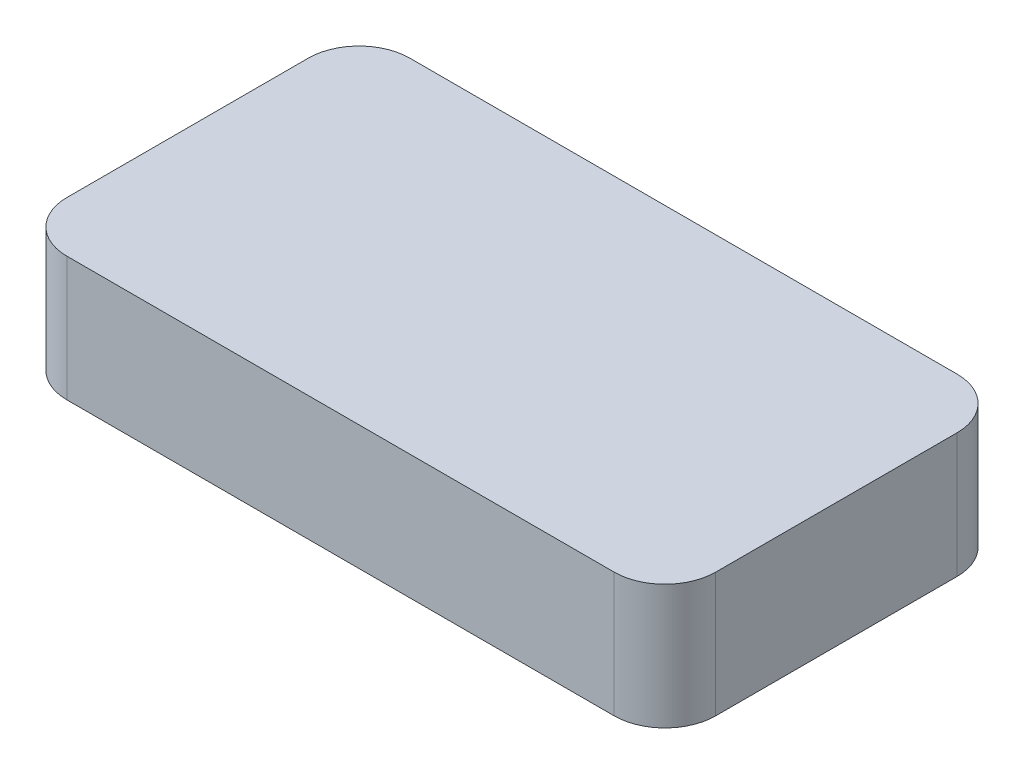
ISO-10303-21;
HEADER;
FILE_DESCRIPTION(('STEP AP214'),'2;1');
FILE_NAME('part.step','',(''),(''),'','','');
FILE_SCHEMA(('AUTOMOTIVE_DESIGN { 1 0 10303 214 1 1 1 1 }'));
ENDSEC;
DATA;
#1=APPLICATION_CONTEXT('core data for automotive mechanical design processes');
#2=APPLICATION_PROTOCOL_DEFINITION('international standard','automotive_design',2000,#1);
#3=PRODUCT_CONTEXT('',#1,'mechanical');
#4=PRODUCT('Part','Part','',(#3));
#5=PRODUCT_RELATED_PRODUCT_CATEGORY('part','',(#4));
#6=PRODUCT_DEFINITION_FORMATION('','',#4);
#7=PRODUCT_DEFINITION_CONTEXT('part definition',#1,'design');
#8=PRODUCT_DEFINITION('design','',#6,#7);
#9=PRODUCT_DEFINITION_SHAPE('','',#8);
#10=(LENGTH_UNIT() NAMED_UNIT(*) SI_UNIT(.MILLI.,.METRE.));
#11=(NAMED_UNIT(*) PLANE_ANGLE_UNIT() SI_UNIT($,.RADIAN.));
#12=(NAMED_UNIT(*) SI_UNIT($,.STERADIAN.) SOLID_ANGLE_UNIT());
#13=UNCERTAINTY_MEASURE_WITH_UNIT(LENGTH_MEASURE(1.E-05),#10,'distance_accuracy_value','');
#14=(GEOMETRIC_REPRESENTATION_CONTEXT(3) GLOBAL_UNCERTAINTY_ASSIGNED_CONTEXT((#13)) GLOBAL_UNIT_ASSIGNED_CONTEXT((#10,
#11,#12)) REPRESENTATION_CONTEXT('',''));
#15=CARTESIAN_POINT('',(0.,0.,0.));
#16=DIRECTION('',(0.,0.,1.));
#17=DIRECTION('',(1.,0.,0.));
#18=AXIS2_PLACEMENT_3D('',#15,#16,#17);
#19=CARTESIAN_POINT('',(0.,6.223,0.));
#20=DIRECTION('',(1.,0.,0.));
#21=DIRECTION('',(0.,0.,-1.));
#22=AXIS2_PLACEMENT_3D('',#19,#20,#21);
#23=PLANE('',#22);
#24=DIRECTION('',(0.,0.,1.));
#25=VECTOR('',#24,1.);
#26=CARTESIAN_POINT('',(0.,0.,0.));
#27=LINE('',#26,#25);
#28=CARTESIAN_POINT('',(0.,0.,-14.605));
#29=VERTEX_POINT('',#28);
#30=CARTESIAN_POINT('',(0.,0.,-2.54));
#31=VERTEX_POINT('',#30);
#32=EDGE_CURVE('E157',#29,#31,#27,.T.);
#33=ORIENTED_EDGE('',*,*,#32,.T.);
#34=DIRECTION('',(0.,-1.,0.));
#35=VECTOR('',#34,1.);
#36=CARTESIAN_POINT('',(0.,6.223,-2.54));
#37=LINE('',#36,#35);
#38=CARTESIAN_POINT('',(0.,6.223,-2.54));
#39=VERTEX_POINT('',#38);
#40=EDGE_CURVE('E11',#31,#39,#37,.F.);
#41=ORIENTED_EDGE('',*,*,#40,.T.);
#42=DIRECTION('',(0.,0.,1.));
#43=VECTOR('',#42,1.);
#44=CARTESIAN_POINT('',(0.,6.223,0.));
#45=LINE('',#44,#43);
#46=CARTESIAN_POINT('',(0.,6.223,-14.605));
#47=VERTEX_POINT('',#46);
#48=EDGE_CURVE('E125',#47,#39,#45,.T.);
#49=ORIENTED_EDGE('',*,*,#48,.F.);
#50=DIRECTION('',(0.,-1.,0.));
#51=VECTOR('',#50,1.);
#52=CARTESIAN_POINT('',(0.,6.223,-14.605));
#53=LINE('',#52,#51);
#54=EDGE_CURVE('E41',#47,#29,#53,.T.);
#55=ORIENTED_EDGE('',*,*,#54,.T.);
#56=EDGE_LOOP('',(#33,#41,#49,#55));
#57=FACE_BOUND('',#56,.T.);
#58=ADVANCED_FACE('F33',(#57),#23,.F.);
#59=CARTESIAN_POINT('',(0.,6.223,0.));
#60=DIRECTION('',(0.,0.,-1.));
#61=DIRECTION('',(-1.,0.,0.));
#62=AXIS2_PLACEMENT_3D('',#59,#60,#61);
#63=PLANE('',#62);
#64=DIRECTION('',(1.,0.,0.));
#65=VECTOR('',#64,1.);
#66=CARTESIAN_POINT('',(0.,0.,0.));
#67=LINE('',#66,#65);
#68=CARTESIAN_POINT('',(2.54,0.,0.));
#69=VERTEX_POINT('',#68);
#70=CARTESIAN_POINT('',(29.8958,0.,0.));
#71=VERTEX_POINT('',#70);
#72=EDGE_CURVE('E130',#69,#71,#67,.T.);
#73=ORIENTED_EDGE('',*,*,#72,.T.);
#74=DIRECTION('',(0.,-1.,0.));
#75=VECTOR('',#74,1.);
#76=CARTESIAN_POINT('',(29.8958,6.223,0.));
#77=LINE('',#76,#75);
#78=CARTESIAN_POINT('',(29.8958,6.223,0.));
#79=VERTEX_POINT('',#78);
#80=EDGE_CURVE('E48',#71,#79,#77,.F.);
#81=ORIENTED_EDGE('',*,*,#80,.T.);
#82=DIRECTION('',(1.,0.,0.));
#83=VECTOR('',#82,1.);
#84=CARTESIAN_POINT('',(0.,6.223,0.));
#85=LINE('',#84,#83);
#86=CARTESIAN_POINT('',(2.54,6.223,0.));
#87=VERTEX_POINT('',#86);
#88=EDGE_CURVE('E128',#87,#79,#85,.T.);
#89=ORIENTED_EDGE('',*,*,#88,.F.);
#90=DIRECTION('',(0.,-1.,0.));
#91=VECTOR('',#90,1.);
#92=CARTESIAN_POINT('',(2.54,6.223,0.));
#93=LINE('',#92,#91);
#94=EDGE_CURVE('E149',#87,#69,#93,.T.);
#95=ORIENTED_EDGE('',*,*,#94,.T.);
#96=EDGE_LOOP('',(#73,#81,#89,#95));
#97=FACE_BOUND('',#96,.T.);
#98=ADVANCED_FACE('F177',(#97),#63,.F.);
#99=CARTESIAN_POINT('',(32.4358,6.223,0.));
#100=DIRECTION('',(-1.,0.,0.));
#101=DIRECTION('',(0.,0.,1.));
#102=AXIS2_PLACEMENT_3D('',#99,#100,#101);
#103=PLANE('',#102);
#104=DIRECTION('',(0.,0.,-1.));
#105=VECTOR('',#104,1.);
#106=CARTESIAN_POINT('',(32.4358,0.,0.));
#107=LINE('',#106,#105);
#108=CARTESIAN_POINT('',(32.4358,0.,-2.54));
#109=VERTEX_POINT('',#108);
#110=CARTESIAN_POINT('',(32.4358,0.,-14.605));
#111=VERTEX_POINT('',#110);
#112=EDGE_CURVE('E126',#109,#111,#107,.T.);
#113=ORIENTED_EDGE('',*,*,#112,.T.);
#114=DIRECTION('',(0.,-1.,0.));
#115=VECTOR('',#114,1.);
#116=CARTESIAN_POINT('',(32.4358,6.223,-14.605));
#117=LINE('',#116,#115);
#118=CARTESIAN_POINT('',(32.4358,6.223,-14.605));
#119=VERTEX_POINT('',#118);
#120=EDGE_CURVE('E104',#111,#119,#117,.F.);
#121=ORIENTED_EDGE('',*,*,#120,.T.);
#122=DIRECTION('',(0.,0.,-1.));
#123=VECTOR('',#122,1.);
#124=CARTESIAN_POINT('',(32.4358,6.223,0.));
#125=LINE('',#124,#123);
#126=CARTESIAN_POINT('',(32.4358,6.223,-2.54));
#127=VERTEX_POINT('',#126);
#128=EDGE_CURVE('E165',#127,#119,#125,.T.);
#129=ORIENTED_EDGE('',*,*,#128,.F.);
#130=DIRECTION('',(0.,-1.,0.));
#131=VECTOR('',#130,1.);
#132=CARTESIAN_POINT('',(32.4358,6.223,-2.54));
#133=LINE('',#132,#131);
#134=EDGE_CURVE('E109',#127,#109,#133,.T.);
#135=ORIENTED_EDGE('',*,*,#134,.T.);
#136=EDGE_LOOP('',(#113,#121,#129,#135));
#137=FACE_BOUND('',#136,.T.);
#138=ADVANCED_FACE('F176',(#137),#103,.F.);
#139=CARTESIAN_POINT('',(0.,6.223,-17.145));
#140=DIRECTION('',(0.,0.,1.));
#141=DIRECTION('',(1.,0.,0.));
#142=AXIS2_PLACEMENT_3D('',#139,#140,#141);
#143=PLANE('',#142);
#144=DIRECTION('',(-1.,0.,0.));
#145=VECTOR('',#144,1.);
#146=CARTESIAN_POINT('',(0.,6.223,-17.145));
#147=LINE('',#146,#145);
#148=CARTESIAN_POINT('',(29.8958,6.223,-17.145));
#149=VERTEX_POINT('',#148);
#150=CARTESIAN_POINT('',(2.54,6.223,-17.145));
#151=VERTEX_POINT('',#150);
#152=EDGE_CURVE('E119',#149,#151,#147,.T.);
#153=ORIENTED_EDGE('',*,*,#152,.F.);
#154=DIRECTION('',(0.,-1.,0.));
#155=VECTOR('',#154,1.);
#156=CARTESIAN_POINT('',(29.8958,6.223,-17.145));
#157=LINE('',#156,#155);
#158=CARTESIAN_POINT('',(29.8958,0.,-17.145));
#159=VERTEX_POINT('',#158);
#160=EDGE_CURVE('E103',#149,#159,#157,.T.);
#161=ORIENTED_EDGE('',*,*,#160,.T.);
#162=DIRECTION('',(-1.,0.,0.));
#163=VECTOR('',#162,1.);
#164=CARTESIAN_POINT('',(0.,0.,-17.145));
#165=LINE('',#164,#163);
#166=CARTESIAN_POINT('',(2.54,0.,-17.145));
#167=VERTEX_POINT('',#166);
#168=EDGE_CURVE('E116',#159,#167,#165,.T.);
#169=ORIENTED_EDGE('',*,*,#168,.T.);
#170=DIRECTION('',(0.,-1.,0.));
#171=VECTOR('',#170,1.);
#172=CARTESIAN_POINT('',(2.54,6.223,-17.145));
#173=LINE('',#172,#171);
#174=EDGE_CURVE('E121',#167,#151,#173,.F.);
#175=ORIENTED_EDGE('',*,*,#174,.T.);
#176=EDGE_LOOP('',(#153,#161,#169,#175));
#177=FACE_BOUND('',#176,.T.);
#178=ADVANCED_FACE('F115',(#177),#143,.F.);
#179=CARTESIAN_POINT('',(0.,6.223,0.));
#180=DIRECTION('',(0.,-1.,0.));
#181=DIRECTION('',(0.,0.,-1.));
#182=AXIS2_PLACEMENT_3D('',#179,#180,#181);
#183=PLANE('',#182);
#184=ORIENTED_EDGE('',*,*,#128,.T.);
#185=CARTESIAN_POINT('',(29.8958,6.223,-14.605));
#186=DIRECTION('',(0.,-1.,0.));
#187=DIRECTION('',(0.,0.,-1.));
#188=AXIS2_PLACEMENT_3D('',#185,#186,#187);
#189=CIRCLE('',#188,2.54);
#190=EDGE_CURVE('E147',#119,#149,#189,.F.);
#191=ORIENTED_EDGE('',*,*,#190,.T.);
#192=ORIENTED_EDGE('',*,*,#152,.T.);
#193=CARTESIAN_POINT('',(2.54,6.223,-14.605));
#194=DIRECTION('',(0.,-1.,0.));
#195=DIRECTION('',(0.,0.,-1.));
#196=AXIS2_PLACEMENT_3D('',#193,#194,#195);
#197=CIRCLE('',#196,2.54);
#198=EDGE_CURVE('E142',#151,#47,#197,.F.);
#199=ORIENTED_EDGE('',*,*,#198,.T.);
#200=ORIENTED_EDGE('',*,*,#48,.T.);
#201=CARTESIAN_POINT('',(2.54,6.223,-2.54));
#202=DIRECTION('',(0.,-1.,0.));
#203=DIRECTION('',(0.,0.,-1.));
#204=AXIS2_PLACEMENT_3D('',#201,#202,#203);
#205=CIRCLE('',#204,2.54);
#206=EDGE_CURVE('E55',#39,#87,#205,.F.);
#207=ORIENTED_EDGE('',*,*,#206,.T.);
#208=ORIENTED_EDGE('',*,*,#88,.T.);
#209=CARTESIAN_POINT('',(29.8958,6.223,-2.54));
#210=DIRECTION('',(0.,-1.,0.));
#211=DIRECTION('',(0.,0.,-1.));
#212=AXIS2_PLACEMENT_3D('',#209,#210,#211);
#213=CIRCLE('',#212,2.54);
#214=EDGE_CURVE('E145',#79,#127,#213,.F.);
#215=ORIENTED_EDGE('',*,*,#214,.T.);
#216=EDGE_LOOP('',(#184,#191,#192,#199,#200,#207,#208,#215));
#217=FACE_BOUND('',#216,.T.);
#218=ADVANCED_FACE('F169',(#217),#183,.F.);
#219=CARTESIAN_POINT('',(0.,0.,0.));
#220=DIRECTION('',(0.,-1.,0.));
#221=DIRECTION('',(0.,0.,-1.));
#222=AXIS2_PLACEMENT_3D('',#219,#220,#221);
#223=PLANE('',#222);
#224=ORIENTED_EDGE('',*,*,#168,.F.);
#225=CARTESIAN_POINT('',(29.8958,0.,-14.605));
#226=DIRECTION('',(0.,-1.,0.));
#227=DIRECTION('',(0.,0.,-1.));
#228=AXIS2_PLACEMENT_3D('',#225,#226,#227);
#229=CIRCLE('',#228,2.54);
#230=EDGE_CURVE('E99',#159,#111,#229,.T.);
#231=ORIENTED_EDGE('',*,*,#230,.T.);
#232=ORIENTED_EDGE('',*,*,#112,.F.);
#233=CARTESIAN_POINT('',(29.8958,0.,-2.54));
#234=DIRECTION('',(0.,-1.,0.));
#235=DIRECTION('',(0.,0.,-1.));
#236=AXIS2_PLACEMENT_3D('',#233,#234,#235);
#237=CIRCLE('',#236,2.54);
#238=EDGE_CURVE('E110',#109,#71,#237,.T.);
#239=ORIENTED_EDGE('',*,*,#238,.T.);
#240=ORIENTED_EDGE('',*,*,#72,.F.);
#241=CARTESIAN_POINT('',(2.54,0.,-2.54));
#242=DIRECTION('',(0.,-1.,0.));
#243=DIRECTION('',(0.,0.,-1.));
#244=AXIS2_PLACEMENT_3D('',#241,#242,#243);
#245=CIRCLE('',#244,2.54);
#246=EDGE_CURVE('E136',#69,#31,#245,.T.);
#247=ORIENTED_EDGE('',*,*,#246,.T.);
#248=ORIENTED_EDGE('',*,*,#32,.F.);
#249=CARTESIAN_POINT('',(2.54,0.,-14.605));
#250=DIRECTION('',(0.,-1.,0.));
#251=DIRECTION('',(0.,0.,-1.));
#252=AXIS2_PLACEMENT_3D('',#249,#250,#251);
#253=CIRCLE('',#252,2.54);
#254=EDGE_CURVE('E120',#29,#167,#253,.T.);
#255=ORIENTED_EDGE('',*,*,#254,.T.);
#256=EDGE_LOOP('',(#224,#231,#232,#239,#240,#247,#248,#255));
#257=FACE_BOUND('',#256,.T.);
#258=ADVANCED_FACE('F123',(#257),#223,.T.);
#259=CARTESIAN_POINT('',(29.8958,6.223,-14.605));
#260=DIRECTION('',(0.,-1.,0.));
#261=DIRECTION('',(0.,0.,-1.));
#262=AXIS2_PLACEMENT_3D('',#259,#260,#261);
#263=CYLINDRICAL_SURFACE('',#262,2.54);
#264=ORIENTED_EDGE('',*,*,#190,.F.);
#265=ORIENTED_EDGE('',*,*,#120,.F.);
#266=ORIENTED_EDGE('',*,*,#230,.F.);
#267=ORIENTED_EDGE('',*,*,#160,.F.);
#268=EDGE_LOOP('',(#264,#265,#266,#267));
#269=FACE_BOUND('',#268,.T.);
#270=ADVANCED_FACE('F102',(#269),#263,.T.);
#271=CARTESIAN_POINT('',(29.8958,6.223,-2.54));
#272=DIRECTION('',(0.,-1.,0.));
#273=DIRECTION('',(0.,0.,-1.));
#274=AXIS2_PLACEMENT_3D('',#271,#272,#273);
#275=CYLINDRICAL_SURFACE('',#274,2.54);
#276=ORIENTED_EDGE('',*,*,#214,.F.);
#277=ORIENTED_EDGE('',*,*,#80,.F.);
#278=ORIENTED_EDGE('',*,*,#238,.F.);
#279=ORIENTED_EDGE('',*,*,#134,.F.);
#280=EDGE_LOOP('',(#276,#277,#278,#279));
#281=FACE_BOUND('',#280,.T.);
#282=ADVANCED_FACE('F174',(#281),#275,.T.);
#283=CARTESIAN_POINT('',(2.54,6.223,-2.54));
#284=DIRECTION('',(0.,-1.,0.));
#285=DIRECTION('',(0.,0.,-1.));
#286=AXIS2_PLACEMENT_3D('',#283,#284,#285);
#287=CYLINDRICAL_SURFACE('',#286,2.54);
#288=ORIENTED_EDGE('',*,*,#206,.F.);
#289=ORIENTED_EDGE('',*,*,#40,.F.);
#290=ORIENTED_EDGE('',*,*,#246,.F.);
#291=ORIENTED_EDGE('',*,*,#94,.F.);
#292=EDGE_LOOP('',(#288,#289,#290,#291));
#293=FACE_BOUND('',#292,.T.);
#294=ADVANCED_FACE('F179',(#293),#287,.T.);
#295=CARTESIAN_POINT('',(2.54,6.223,-14.605));
#296=DIRECTION('',(0.,-1.,0.));
#297=DIRECTION('',(0.,0.,-1.));
#298=AXIS2_PLACEMENT_3D('',#295,#296,#297);
#299=CYLINDRICAL_SURFACE('',#298,2.54);
#300=ORIENTED_EDGE('',*,*,#198,.F.);
#301=ORIENTED_EDGE('',*,*,#174,.F.);
#302=ORIENTED_EDGE('',*,*,#254,.F.);
#303=ORIENTED_EDGE('',*,*,#54,.F.);
#304=EDGE_LOOP('',(#300,#301,#302,#303));
#305=FACE_BOUND('',#304,.T.);
#306=ADVANCED_FACE('F35',(#305),#299,.T.);
#307=CLOSED_SHELL('',(#58,#98,#138,#178,#218,#258,#270,#282,#294,#306));
#308=MANIFOLD_SOLID_BREP('B2',#307);
#309=ADVANCED_BREP_SHAPE_REPRESENTATION('',(#18,#308),#14);
#310=SHAPE_DEFINITION_REPRESENTATION(#9,#309);
ENDSEC;
END-ISO-10303-21;
